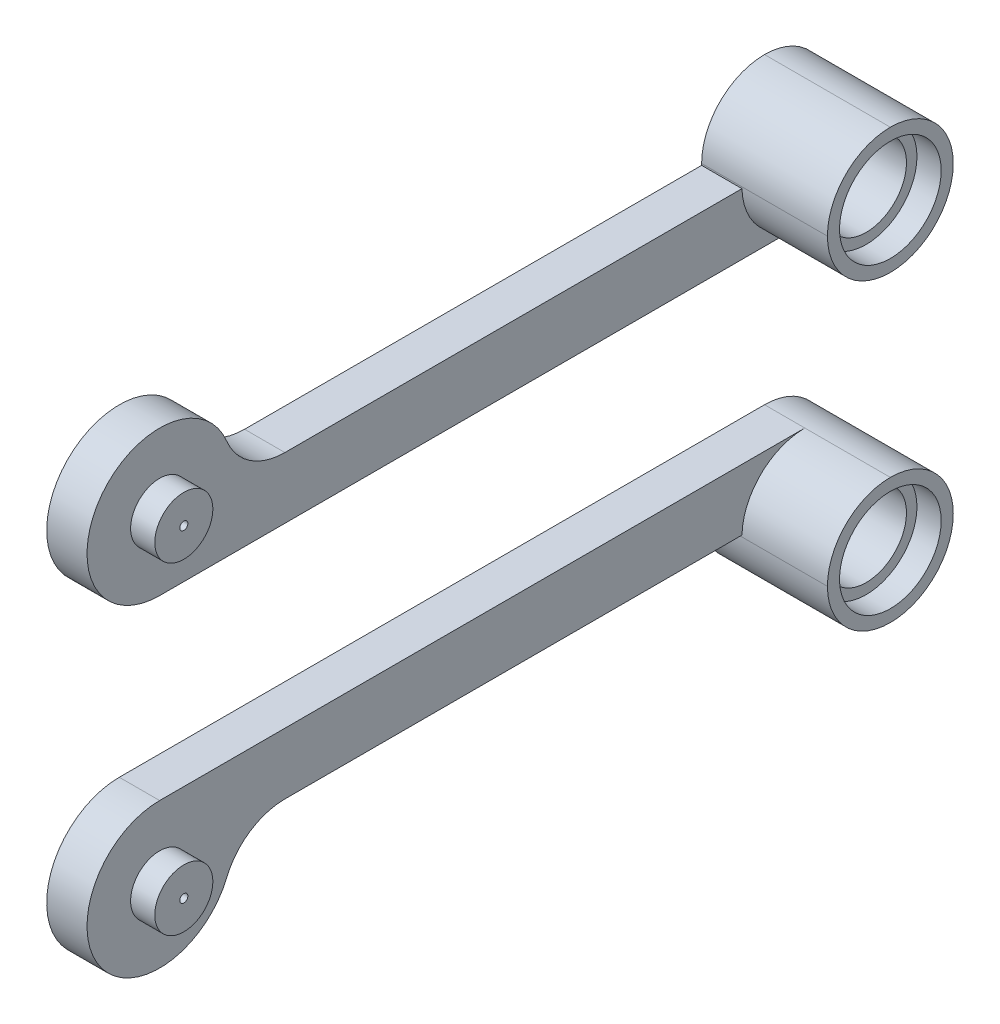
ISO-10303-21;
HEADER;
FILE_DESCRIPTION(('STEP AP214'),'2;1');
FILE_NAME('part.step','',(''),(''),'','','');
FILE_SCHEMA(('AUTOMOTIVE_DESIGN { 1 0 10303 214 1 1 1 1 }'));
ENDSEC;
DATA;
#1=APPLICATION_CONTEXT('core data for automotive mechanical design processes');
#2=APPLICATION_PROTOCOL_DEFINITION('international standard','automotive_design',2000,#1);
#3=PRODUCT_CONTEXT('',#1,'mechanical');
#4=PRODUCT('Part','Part','',(#3));
#5=PRODUCT_RELATED_PRODUCT_CATEGORY('part','',(#4));
#6=PRODUCT_DEFINITION_FORMATION('','',#4);
#7=PRODUCT_DEFINITION_CONTEXT('part definition',#1,'design');
#8=PRODUCT_DEFINITION('design','',#6,#7);
#9=PRODUCT_DEFINITION_SHAPE('','',#8);
#10=(LENGTH_UNIT() NAMED_UNIT(*) SI_UNIT(.MILLI.,.METRE.));
#11=(NAMED_UNIT(*) PLANE_ANGLE_UNIT() SI_UNIT($,.RADIAN.));
#12=(NAMED_UNIT(*) SI_UNIT($,.STERADIAN.) SOLID_ANGLE_UNIT());
#13=UNCERTAINTY_MEASURE_WITH_UNIT(LENGTH_MEASURE(1.E-05),#10,'distance_accuracy_value','');
#14=(GEOMETRIC_REPRESENTATION_CONTEXT(3) GLOBAL_UNCERTAINTY_ASSIGNED_CONTEXT((#13)) GLOBAL_UNIT_ASSIGNED_CONTEXT((#10,
#11,#12)) REPRESENTATION_CONTEXT('',''));
#15=CARTESIAN_POINT('',(0.,0.,0.));
#16=DIRECTION('',(0.,0.,1.));
#17=DIRECTION('',(1.,0.,0.));
#18=AXIS2_PLACEMENT_3D('',#15,#16,#17);
#19=CARTESIAN_POINT('',(7.8,-19.4,-40.));
#20=DIRECTION('',(-1.,0.,0.));
#21=DIRECTION('',(0.,0.,1.));
#22=AXIS2_PLACEMENT_3D('',#19,#20,#21);
#23=CYLINDRICAL_SURFACE('',#22,2.5);
#24=CARTESIAN_POINT('',(1.5,-19.4,-40.));
#25=DIRECTION('',(-1.,0.,0.));
#26=DIRECTION('',(0.,0.,-1.));
#27=AXIS2_PLACEMENT_3D('',#24,#25,#26);
#28=CIRCLE('',#27,2.5);
#29=CARTESIAN_POINT('',(1.5,-19.4,-42.5));
#30=VERTEX_POINT('',#29);
#31=EDGE_CURVE('E233',#30,#30,#28,.T.);
#32=ORIENTED_EDGE('',*,*,#31,.T.);
#33=EDGE_LOOP('',(#32));
#34=FACE_BOUND('',#33,.T.);
#35=CARTESIAN_POINT('',(6.3,-19.4,-40.));
#36=DIRECTION('',(-1.,0.,0.));
#37=DIRECTION('',(0.,0.,-1.));
#38=AXIS2_PLACEMENT_3D('',#35,#36,#37);
#39=CIRCLE('',#38,2.5);
#40=CARTESIAN_POINT('',(6.3,-19.4,-42.5));
#41=VERTEX_POINT('',#40);
#42=EDGE_CURVE('E221',#41,#41,#39,.T.);
#43=ORIENTED_EDGE('',*,*,#42,.F.);
#44=EDGE_LOOP('',(#43));
#45=FACE_BOUND('',#44,.T.);
#46=ADVANCED_FACE('F78',(#34,#45),#23,.F.);
#47=CARTESIAN_POINT('',(2.5,-20.,0.));
#48=DIRECTION('',(-1.,0.,0.));
#49=DIRECTION('',(0.,0.,1.));
#50=AXIS2_PLACEMENT_3D('',#47,#48,#49);
#51=CYLINDRICAL_SURFACE('',#50,4.5);
#52=CARTESIAN_POINT('',(2.5,-20.,0.));
#53=DIRECTION('',(-1.,0.,0.));
#54=DIRECTION('',(0.,0.,-1.));
#55=AXIS2_PLACEMENT_3D('',#52,#53,#54);
#56=CIRCLE('',#55,4.5);
#57=CARTESIAN_POINT('',(2.5,-21.7142857142857,-4.16067596548877));
#58=VERTEX_POINT('',#57);
#59=CARTESIAN_POINT('',(2.5,-15.5,0.));
#60=VERTEX_POINT('',#59);
#61=EDGE_CURVE('E171',#58,#60,#56,.T.);
#62=ORIENTED_EDGE('',*,*,#61,.T.);
#63=DIRECTION('',(-1.,0.,0.));
#64=VECTOR('',#63,1.);
#65=CARTESIAN_POINT('',(2.5,-15.5,0.));
#66=LINE('',#65,#64);
#67=CARTESIAN_POINT('',(0.,-15.5,0.));
#68=VERTEX_POINT('',#67);
#69=EDGE_CURVE('E152',#60,#68,#66,.T.);
#70=ORIENTED_EDGE('',*,*,#69,.T.);
#71=CARTESIAN_POINT('',(0.,-20.,0.));
#72=DIRECTION('',(-1.,0.,0.));
#73=DIRECTION('',(0.,0.,-1.));
#74=AXIS2_PLACEMENT_3D('',#71,#72,#73);
#75=CIRCLE('',#74,4.5);
#76=CARTESIAN_POINT('',(0.,-21.7142857142857,-4.16067596548877));
#77=VERTEX_POINT('',#76);
#78=EDGE_CURVE('E163',#77,#68,#75,.T.);
#79=ORIENTED_EDGE('',*,*,#78,.F.);
#80=DIRECTION('',(-1.,0.,0.));
#81=VECTOR('',#80,1.);
#82=CARTESIAN_POINT('',(2.5,-21.7142857142857,-4.16067596548877));
#83=LINE('',#82,#81);
#84=EDGE_CURVE('E178',#58,#77,#83,.T.);
#85=ORIENTED_EDGE('',*,*,#84,.F.);
#86=EDGE_LOOP('',(#62,#70,#79,#85));
#87=FACE_BOUND('',#86,.T.);
#88=ADVANCED_FACE('F173',(#87),#51,.T.);
#89=CARTESIAN_POINT('',(0.,-20.,0.));
#90=DIRECTION('',(1.,0.,0.));
#91=DIRECTION('',(0.,0.,-1.));
#92=AXIS2_PLACEMENT_3D('',#89,#90,#91);
#93=PLANE('',#92);
#94=CARTESIAN_POINT('',(0.,-19.4,-40.));
#95=DIRECTION('',(-1.,0.,0.));
#96=DIRECTION('',(0.,0.,-1.));
#97=AXIS2_PLACEMENT_3D('',#94,#95,#96);
#98=CIRCLE('',#97,3.15);
#99=CARTESIAN_POINT('',(0.,-19.4,-43.15));
#100=VERTEX_POINT('',#99);
#101=EDGE_CURVE('E230',#100,#100,#98,.T.);
#102=ORIENTED_EDGE('',*,*,#101,.F.);
#103=EDGE_LOOP('',(#102));
#104=FACE_BOUND('',#103,.T.);
#105=DIRECTION('',(0.,0.,1.));
#106=VECTOR('',#105,1.);
#107=CARTESIAN_POINT('',(0.,-19.3,0.));
#108=LINE('',#107,#106);
#109=CARTESIAN_POINT('',(0.,-19.3,-36.1012822620764));
#110=VERTEX_POINT('',#109);
#111=CARTESIAN_POINT('',(0.,-19.3,-7.76659513557904));
#112=VERTEX_POINT('',#111);
#113=EDGE_CURVE('E216',#110,#112,#108,.T.);
#114=ORIENTED_EDGE('',*,*,#113,.T.);
#115=CARTESIAN_POINT('',(0.,-23.2,-7.76659513557904));
#116=DIRECTION('',(-1.,0.,0.));
#117=DIRECTION('',(0.,0.,-1.));
#118=AXIS2_PLACEMENT_3D('',#115,#116,#117);
#119=CIRCLE('',#118,3.9);
#120=EDGE_CURVE('E167',#77,#112,#119,.T.);
#121=ORIENTED_EDGE('',*,*,#120,.F.);
#122=ORIENTED_EDGE('',*,*,#78,.T.);
#123=DIRECTION('',(0.,0.,-1.));
#124=VECTOR('',#123,1.);
#125=CARTESIAN_POINT('',(0.,-15.5,0.));
#126=LINE('',#125,#124);
#127=CARTESIAN_POINT('',(0.,-15.5,-40.));
#128=VERTEX_POINT('',#127);
#129=EDGE_CURVE('E147',#68,#128,#126,.T.);
#130=ORIENTED_EDGE('',*,*,#129,.T.);
#131=CARTESIAN_POINT('',(0.,-19.4,-40.));
#132=DIRECTION('',(-1.,0.,0.));
#133=DIRECTION('',(0.,0.,-1.));
#134=AXIS2_PLACEMENT_3D('',#131,#132,#133);
#135=CIRCLE('',#134,3.9);
#136=CARTESIAN_POINT('',(0.,-19.4,-43.9));
#137=VERTEX_POINT('',#136);
#138=EDGE_CURVE('E189',#137,#128,#135,.F.);
#139=ORIENTED_EDGE('',*,*,#138,.F.);
#140=CARTESIAN_POINT('',(0.,-19.4,-40.));
#141=DIRECTION('',(-1.,0.,0.));
#142=DIRECTION('',(0.,0.,-1.));
#143=AXIS2_PLACEMENT_3D('',#140,#141,#142);
#144=CIRCLE('',#143,3.9);
#145=CARTESIAN_POINT('',(0.,-23.3,-40.));
#146=VERTEX_POINT('',#145);
#147=EDGE_CURVE('E186',#146,#137,#144,.F.);
#148=ORIENTED_EDGE('',*,*,#147,.F.);
#149=CARTESIAN_POINT('',(0.,-19.4,-40.));
#150=DIRECTION('',(-1.,0.,0.));
#151=DIRECTION('',(0.,0.,-1.));
#152=AXIS2_PLACEMENT_3D('',#149,#150,#151);
#153=CIRCLE('',#152,3.9);
#154=CARTESIAN_POINT('',(0.,-19.4,-36.1));
#155=VERTEX_POINT('',#154);
#156=EDGE_CURVE('E191',#155,#146,#153,.F.);
#157=ORIENTED_EDGE('',*,*,#156,.F.);
#158=CARTESIAN_POINT('',(0.,-19.4,-40.));
#159=DIRECTION('',(-1.,0.,0.));
#160=DIRECTION('',(0.,0.,-1.));
#161=AXIS2_PLACEMENT_3D('',#158,#159,#160);
#162=CIRCLE('',#161,3.9);
#163=EDGE_CURVE('E193',#110,#155,#162,.F.);
#164=ORIENTED_EDGE('',*,*,#163,.F.);
#165=EDGE_LOOP('',(#114,#121,#122,#130,#139,#148,#157,#164));
#166=FACE_BOUND('',#165,.T.);
#167=ADVANCED_FACE('F165',(#104,#166),#93,.F.);
#168=CARTESIAN_POINT('',(2.5,-20.,0.));
#169=DIRECTION('',(1.,0.,0.));
#170=DIRECTION('',(0.,0.,-1.));
#171=AXIS2_PLACEMENT_3D('',#168,#169,#170);
#172=PLANE('',#171);
#173=DIRECTION('',(0.,0.,-1.));
#174=VECTOR('',#173,1.);
#175=CARTESIAN_POINT('',(2.5,-19.3,0.));
#176=LINE('',#175,#174);
#177=CARTESIAN_POINT('',(2.5,-19.3,-7.76659513557904));
#178=VERTEX_POINT('',#177);
#179=CARTESIAN_POINT('',(2.5,-19.3,-36.1012822620764));
#180=VERTEX_POINT('',#179);
#181=EDGE_CURVE('E217',#178,#180,#176,.T.);
#182=ORIENTED_EDGE('',*,*,#181,.T.);
#183=CARTESIAN_POINT('',(2.5,-19.4,-40.));
#184=DIRECTION('',(-1.,0.,0.));
#185=DIRECTION('',(0.,0.,-1.));
#186=AXIS2_PLACEMENT_3D('',#183,#184,#185);
#187=CIRCLE('',#186,3.9);
#188=CARTESIAN_POINT('',(2.5,-15.5,-40.));
#189=VERTEX_POINT('',#188);
#190=EDGE_CURVE('E87',#189,#180,#187,.F.);
#191=ORIENTED_EDGE('',*,*,#190,.F.);
#192=DIRECTION('',(0.,0.,-1.));
#193=VECTOR('',#192,1.);
#194=CARTESIAN_POINT('',(2.5,-15.5,0.));
#195=LINE('',#194,#193);
#196=EDGE_CURVE('E159',#60,#189,#195,.T.);
#197=ORIENTED_EDGE('',*,*,#196,.F.);
#198=ORIENTED_EDGE('',*,*,#61,.F.);
#199=CARTESIAN_POINT('',(2.5,-23.2,-7.76659513557904));
#200=DIRECTION('',(-1.,0.,0.));
#201=DIRECTION('',(0.,0.,-1.));
#202=AXIS2_PLACEMENT_3D('',#199,#200,#201);
#203=CIRCLE('',#202,3.9);
#204=EDGE_CURVE('E208',#178,#58,#203,.F.);
#205=ORIENTED_EDGE('',*,*,#204,.F.);
#206=EDGE_LOOP('',(#182,#191,#197,#198,#205));
#207=FACE_BOUND('',#206,.T.);
#208=CARTESIAN_POINT('',(2.5,-20.,0.));
#209=DIRECTION('',(-1.,0.,0.));
#210=DIRECTION('',(0.,0.,-1.));
#211=AXIS2_PLACEMENT_3D('',#208,#209,#210);
#212=CIRCLE('',#211,1.8);
#213=CARTESIAN_POINT('',(2.5,-20.,-1.8));
#214=VERTEX_POINT('',#213);
#215=EDGE_CURVE('E244',#214,#214,#212,.T.);
#216=ORIENTED_EDGE('',*,*,#215,.T.);
#217=EDGE_LOOP('',(#216));
#218=FACE_BOUND('',#217,.T.);
#219=ADVANCED_FACE('F250',(#207,#218),#172,.T.);
#220=CARTESIAN_POINT('',(2.5,-15.5,0.));
#221=DIRECTION('',(0.,-1.,0.));
#222=DIRECTION('',(0.,0.,1.));
#223=AXIS2_PLACEMENT_3D('',#220,#221,#222);
#224=PLANE('',#223);
#225=DIRECTION('',(-1.,0.,0.));
#226=VECTOR('',#225,1.);
#227=CARTESIAN_POINT('',(2.5,-15.5,-40.));
#228=LINE('',#227,#226);
#229=EDGE_CURVE('E155',#128,#189,#228,.F.);
#230=ORIENTED_EDGE('',*,*,#229,.F.);
#231=ORIENTED_EDGE('',*,*,#129,.F.);
#232=ORIENTED_EDGE('',*,*,#69,.F.);
#233=ORIENTED_EDGE('',*,*,#196,.T.);
#234=EDGE_LOOP('',(#230,#231,#232,#233));
#235=FACE_BOUND('',#234,.T.);
#236=ADVANCED_FACE('F149',(#235),#224,.F.);
#237=CARTESIAN_POINT('',(4.,-20.,0.));
#238=DIRECTION('',(1.,0.,0.));
#239=DIRECTION('',(0.,0.,-1.));
#240=AXIS2_PLACEMENT_3D('',#237,#238,#239);
#241=PLANE('',#240);
#242=CARTESIAN_POINT('',(4.,-20.,0.));
#243=DIRECTION('',(-1.,0.,0.));
#244=DIRECTION('',(0.,0.,-1.));
#245=AXIS2_PLACEMENT_3D('',#242,#243,#244);
#246=CIRCLE('',#245,1.8);
#247=CARTESIAN_POINT('',(4.,-20.,-1.8));
#248=VERTEX_POINT('',#247);
#249=EDGE_CURVE('E160',#248,#248,#246,.T.);
#250=ORIENTED_EDGE('',*,*,#249,.F.);
#251=EDGE_LOOP('',(#250));
#252=FACE_BOUND('',#251,.T.);
#253=CARTESIAN_POINT('',(4.,-20.,0.));
#254=DIRECTION('',(-1.,0.,0.));
#255=DIRECTION('',(0.,0.,-1.));
#256=AXIS2_PLACEMENT_3D('',#253,#254,#255);
#257=CIRCLE('',#256,0.25);
#258=CARTESIAN_POINT('',(4.,-20.,-0.25));
#259=VERTEX_POINT('',#258);
#260=EDGE_CURVE('E239',#259,#259,#257,.T.);
#261=ORIENTED_EDGE('',*,*,#260,.T.);
#262=EDGE_LOOP('',(#261));
#263=FACE_BOUND('',#262,.T.);
#264=ADVANCED_FACE('F255',(#252,#263),#241,.T.);
#265=CARTESIAN_POINT('',(4.,-20.,0.));
#266=DIRECTION('',(-1.,0.,0.));
#267=DIRECTION('',(0.,0.,1.));
#268=AXIS2_PLACEMENT_3D('',#265,#266,#267);
#269=CYLINDRICAL_SURFACE('',#268,1.8);
#270=ORIENTED_EDGE('',*,*,#249,.T.);
#271=EDGE_LOOP('',(#270));
#272=FACE_BOUND('',#271,.T.);
#273=ORIENTED_EDGE('',*,*,#215,.F.);
#274=EDGE_LOOP('',(#273));
#275=FACE_BOUND('',#274,.T.);
#276=ADVANCED_FACE('F252',(#272,#275),#269,.T.);
#277=CARTESIAN_POINT('',(4.,-20.,0.));
#278=DIRECTION('',(-1.,0.,0.));
#279=DIRECTION('',(0.,0.,1.));
#280=AXIS2_PLACEMENT_3D('',#277,#278,#279);
#281=CYLINDRICAL_SURFACE('',#280,0.25);
#282=ORIENTED_EDGE('',*,*,#260,.F.);
#283=EDGE_LOOP('',(#282));
#284=FACE_BOUND('',#283,.T.);
#285=CARTESIAN_POINT('',(2.5,-20.,0.));
#286=DIRECTION('',(-1.,0.,0.));
#287=DIRECTION('',(0.,0.,-1.));
#288=AXIS2_PLACEMENT_3D('',#285,#286,#287);
#289=CIRCLE('',#288,0.25);
#290=CARTESIAN_POINT('',(2.5,-20.,-0.25));
#291=VERTEX_POINT('',#290);
#292=EDGE_CURVE('E175',#291,#291,#289,.F.);
#293=ORIENTED_EDGE('',*,*,#292,.F.);
#294=EDGE_LOOP('',(#293));
#295=FACE_BOUND('',#294,.T.);
#296=ADVANCED_FACE('F254',(#284,#295),#281,.F.);
#297=ORIENTED_EDGE('',*,*,#292,.T.);
#298=EDGE_LOOP('',(#297));
#299=FACE_BOUND('',#298,.T.);
#300=ADVANCED_FACE('F262',(#299),#172,.T.);
#301=CARTESIAN_POINT('',(7.8,-20.,0.));
#302=DIRECTION('',(1.,0.,0.));
#303=DIRECTION('',(0.,0.,-1.));
#304=AXIS2_PLACEMENT_3D('',#301,#302,#303);
#305=PLANE('',#304);
#306=CARTESIAN_POINT('',(7.8,-19.4,-40.));
#307=DIRECTION('',(-1.,0.,0.));
#308=DIRECTION('',(0.,0.,-1.));
#309=AXIS2_PLACEMENT_3D('',#306,#307,#308);
#310=CIRCLE('',#309,3.15);
#311=CARTESIAN_POINT('',(7.8,-19.4,-43.15));
#312=VERTEX_POINT('',#311);
#313=EDGE_CURVE('E226',#312,#312,#310,.T.);
#314=ORIENTED_EDGE('',*,*,#313,.T.);
#315=EDGE_LOOP('',(#314));
#316=FACE_BOUND('',#315,.T.);
#317=CARTESIAN_POINT('',(7.8,-19.4,-40.));
#318=DIRECTION('',(-1.,0.,0.));
#319=DIRECTION('',(0.,0.,-1.));
#320=AXIS2_PLACEMENT_3D('',#317,#318,#319);
#321=CIRCLE('',#320,3.9);
#322=CARTESIAN_POINT('',(7.8,-23.3,-40.));
#323=VERTEX_POINT('',#322);
#324=CARTESIAN_POINT('',(7.8,-19.4,-36.1));
#325=VERTEX_POINT('',#324);
#326=EDGE_CURVE('E202',#323,#325,#321,.T.);
#327=ORIENTED_EDGE('',*,*,#326,.F.);
#328=CARTESIAN_POINT('',(7.8,-19.4,-40.));
#329=DIRECTION('',(-1.,0.,0.));
#330=DIRECTION('',(0.,0.,-1.));
#331=AXIS2_PLACEMENT_3D('',#328,#329,#330);
#332=CIRCLE('',#331,3.9);
#333=CARTESIAN_POINT('',(7.8,-19.4,-43.9));
#334=VERTEX_POINT('',#333);
#335=EDGE_CURVE('E197',#334,#323,#332,.T.);
#336=ORIENTED_EDGE('',*,*,#335,.F.);
#337=CARTESIAN_POINT('',(7.8,-19.4,-40.));
#338=DIRECTION('',(-1.,0.,0.));
#339=DIRECTION('',(0.,0.,-1.));
#340=AXIS2_PLACEMENT_3D('',#337,#338,#339);
#341=CIRCLE('',#340,3.9);
#342=CARTESIAN_POINT('',(7.8,-15.5,-40.));
#343=VERTEX_POINT('',#342);
#344=EDGE_CURVE('E199',#343,#334,#341,.T.);
#345=ORIENTED_EDGE('',*,*,#344,.F.);
#346=CARTESIAN_POINT('',(7.8,-19.4,-40.));
#347=DIRECTION('',(-1.,0.,0.));
#348=DIRECTION('',(0.,0.,-1.));
#349=AXIS2_PLACEMENT_3D('',#346,#347,#348);
#350=CIRCLE('',#349,3.9);
#351=EDGE_CURVE('E204',#325,#343,#350,.T.);
#352=ORIENTED_EDGE('',*,*,#351,.F.);
#353=EDGE_LOOP('',(#327,#336,#345,#352));
#354=FACE_BOUND('',#353,.T.);
#355=ADVANCED_FACE('F280',(#316,#354),#305,.T.);
#356=CARTESIAN_POINT('',(1.5,-19.4,-40.));
#357=DIRECTION('',(-1.,0.,0.));
#358=DIRECTION('',(0.,0.,1.));
#359=AXIS2_PLACEMENT_3D('',#356,#357,#358);
#360=CYLINDRICAL_SURFACE('',#359,3.15);
#361=CARTESIAN_POINT('',(1.5,-19.4,-40.));
#362=DIRECTION('',(-1.,0.,0.));
#363=DIRECTION('',(0.,0.,-1.));
#364=AXIS2_PLACEMENT_3D('',#361,#362,#363);
#365=CIRCLE('',#364,3.15);
#366=CARTESIAN_POINT('',(1.5,-19.4,-43.15));
#367=VERTEX_POINT('',#366);
#368=EDGE_CURVE('E236',#367,#367,#365,.T.);
#369=ORIENTED_EDGE('',*,*,#368,.F.);
#370=EDGE_LOOP('',(#369));
#371=FACE_BOUND('',#370,.T.);
#372=ORIENTED_EDGE('',*,*,#101,.T.);
#373=EDGE_LOOP('',(#372));
#374=FACE_BOUND('',#373,.T.);
#375=ADVANCED_FACE('F278',(#371,#374),#360,.F.);
#376=CARTESIAN_POINT('',(1.5,-20.,0.));
#377=DIRECTION('',(1.,0.,0.));
#378=DIRECTION('',(0.,0.,-1.));
#379=AXIS2_PLACEMENT_3D('',#376,#377,#378);
#380=PLANE('',#379);
#381=ORIENTED_EDGE('',*,*,#31,.F.);
#382=EDGE_LOOP('',(#381));
#383=FACE_BOUND('',#382,.T.);
#384=ORIENTED_EDGE('',*,*,#368,.T.);
#385=EDGE_LOOP('',(#384));
#386=FACE_BOUND('',#385,.T.);
#387=ADVANCED_FACE('F287',(#383,#386),#380,.F.);
#388=CARTESIAN_POINT('',(6.3,-19.4,-40.));
#389=DIRECTION('',(1.,0.,0.));
#390=DIRECTION('',(0.,0.,-1.));
#391=AXIS2_PLACEMENT_3D('',#388,#389,#390);
#392=CYLINDRICAL_SURFACE('',#391,3.15);
#393=CARTESIAN_POINT('',(6.3,-19.4,-40.));
#394=DIRECTION('',(-1.,0.,0.));
#395=DIRECTION('',(0.,0.,-1.));
#396=AXIS2_PLACEMENT_3D('',#393,#394,#395);
#397=CIRCLE('',#396,3.15);
#398=CARTESIAN_POINT('',(6.3,-19.4,-43.15));
#399=VERTEX_POINT('',#398);
#400=EDGE_CURVE('E227',#399,#399,#397,.T.);
#401=ORIENTED_EDGE('',*,*,#400,.T.);
#402=EDGE_LOOP('',(#401));
#403=FACE_BOUND('',#402,.T.);
#404=ORIENTED_EDGE('',*,*,#313,.F.);
#405=EDGE_LOOP('',(#404));
#406=FACE_BOUND('',#405,.T.);
#407=ADVANCED_FACE('F407',(#403,#406),#392,.F.);
#408=CARTESIAN_POINT('',(6.3,-19.4,-40.));
#409=DIRECTION('',(1.,0.,0.));
#410=DIRECTION('',(0.,0.,-1.));
#411=AXIS2_PLACEMENT_3D('',#408,#409,#410);
#412=PLANE('',#411);
#413=ORIENTED_EDGE('',*,*,#42,.T.);
#414=EDGE_LOOP('',(#413));
#415=FACE_BOUND('',#414,.T.);
#416=ORIENTED_EDGE('',*,*,#400,.F.);
#417=EDGE_LOOP('',(#416));
#418=FACE_BOUND('',#417,.T.);
#419=ADVANCED_FACE('F314',(#415,#418),#412,.T.);
#420=CARTESIAN_POINT('',(7.8,-19.3,0.));
#421=DIRECTION('',(0.,1.,0.));
#422=DIRECTION('',(0.,0.,-1.));
#423=AXIS2_PLACEMENT_3D('',#420,#421,#422);
#424=PLANE('',#423);
#425=ORIENTED_EDGE('',*,*,#113,.F.);
#426=DIRECTION('',(1.,0.,0.));
#427=VECTOR('',#426,1.);
#428=CARTESIAN_POINT('',(2.5,-19.3,-36.1012822620764));
#429=LINE('',#428,#427);
#430=EDGE_CURVE('E13',#180,#110,#429,.F.);
#431=ORIENTED_EDGE('',*,*,#430,.F.);
#432=ORIENTED_EDGE('',*,*,#181,.F.);
#433=DIRECTION('',(1.,0.,0.));
#434=VECTOR('',#433,1.);
#435=CARTESIAN_POINT('',(2.5,-19.3,-7.76659513557904));
#436=LINE('',#435,#434);
#437=EDGE_CURVE('E184',#112,#178,#436,.T.);
#438=ORIENTED_EDGE('',*,*,#437,.F.);
#439=EDGE_LOOP('',(#425,#431,#432,#438));
#440=FACE_BOUND('',#439,.T.);
#441=ADVANCED_FACE('F308',(#440),#424,.F.);
#442=CARTESIAN_POINT('',(2.5,-23.2,-7.76659513557904));
#443=DIRECTION('',(-1.,0.,0.));
#444=DIRECTION('',(0.,0.,1.));
#445=AXIS2_PLACEMENT_3D('',#442,#443,#444);
#446=CYLINDRICAL_SURFACE('',#445,3.9);
#447=ORIENTED_EDGE('',*,*,#204,.T.);
#448=ORIENTED_EDGE('',*,*,#84,.T.);
#449=ORIENTED_EDGE('',*,*,#120,.T.);
#450=ORIENTED_EDGE('',*,*,#437,.T.);
#451=EDGE_LOOP('',(#447,#448,#449,#450));
#452=FACE_BOUND('',#451,.T.);
#453=ADVANCED_FACE('F302',(#452),#446,.F.);
#454=CARTESIAN_POINT('',(2.5,-19.4,-40.));
#455=DIRECTION('',(1.,0.,0.));
#456=DIRECTION('',(0.,0.,-1.));
#457=AXIS2_PLACEMENT_3D('',#454,#455,#456);
#458=CYLINDRICAL_SURFACE('',#457,3.9);
#459=DIRECTION('',(-1.,0.,0.));
#460=VECTOR('',#459,1.);
#461=CARTESIAN_POINT('',(7.8,-19.4,-43.9));
#462=LINE('',#461,#460);
#463=EDGE_CURVE('E214',#137,#334,#462,.F.);
#464=ORIENTED_EDGE('',*,*,#463,.T.);
#465=ORIENTED_EDGE('',*,*,#335,.T.);
#466=DIRECTION('',(-1.,0.,0.));
#467=VECTOR('',#466,1.);
#468=CARTESIAN_POINT('',(0.,-23.3,-40.));
#469=LINE('',#468,#467);
#470=EDGE_CURVE('E82',#323,#146,#469,.T.);
#471=ORIENTED_EDGE('',*,*,#470,.T.);
#472=ORIENTED_EDGE('',*,*,#147,.T.);
#473=EDGE_LOOP('',(#464,#465,#471,#472));
#474=FACE_BOUND('',#473,.T.);
#475=ADVANCED_FACE('F80',(#474),#458,.T.);
#476=CARTESIAN_POINT('',(7.8,-19.4,-40.));
#477=DIRECTION('',(-1.,0.,0.));
#478=DIRECTION('',(0.,0.,1.));
#479=AXIS2_PLACEMENT_3D('',#476,#477,#478);
#480=CYLINDRICAL_SURFACE('',#479,3.9);
#481=ORIENTED_EDGE('',*,*,#470,.F.);
#482=ORIENTED_EDGE('',*,*,#326,.T.);
#483=DIRECTION('',(-1.,0.,0.));
#484=VECTOR('',#483,1.);
#485=CARTESIAN_POINT('',(7.8,-19.4,-36.1));
#486=LINE('',#485,#484);
#487=EDGE_CURVE('E213',#325,#155,#486,.T.);
#488=ORIENTED_EDGE('',*,*,#487,.T.);
#489=ORIENTED_EDGE('',*,*,#156,.T.);
#490=EDGE_LOOP('',(#481,#482,#488,#489));
#491=FACE_BOUND('',#490,.T.);
#492=ADVANCED_FACE('F296',(#491),#480,.T.);
#493=CARTESIAN_POINT('',(2.5,-19.4,-40.));
#494=DIRECTION('',(-1.,0.,0.));
#495=DIRECTION('',(0.,0.,1.));
#496=AXIS2_PLACEMENT_3D('',#493,#494,#495);
#497=CYLINDRICAL_SURFACE('',#496,3.9);
#498=ORIENTED_EDGE('',*,*,#463,.F.);
#499=ORIENTED_EDGE('',*,*,#138,.T.);
#500=ORIENTED_EDGE('',*,*,#229,.T.);
#501=DIRECTION('',(-1.,0.,0.));
#502=VECTOR('',#501,1.);
#503=CARTESIAN_POINT('',(2.5,-15.5,-40.));
#504=LINE('',#503,#502);
#505=EDGE_CURVE('E211',#189,#343,#504,.F.);
#506=ORIENTED_EDGE('',*,*,#505,.T.);
#507=ORIENTED_EDGE('',*,*,#344,.T.);
#508=EDGE_LOOP('',(#498,#499,#500,#506,#507));
#509=FACE_BOUND('',#508,.T.);
#510=ADVANCED_FACE('F307',(#509),#497,.T.);
#511=CARTESIAN_POINT('',(2.5,-19.4,-40.));
#512=DIRECTION('',(1.,0.,0.));
#513=DIRECTION('',(0.,0.,-1.));
#514=AXIS2_PLACEMENT_3D('',#511,#512,#513);
#515=CYLINDRICAL_SURFACE('',#514,3.9);
#516=ORIENTED_EDGE('',*,*,#351,.T.);
#517=ORIENTED_EDGE('',*,*,#505,.F.);
#518=ORIENTED_EDGE('',*,*,#190,.T.);
#519=ORIENTED_EDGE('',*,*,#430,.T.);
#520=ORIENTED_EDGE('',*,*,#163,.T.);
#521=ORIENTED_EDGE('',*,*,#487,.F.);
#522=EDGE_LOOP('',(#516,#517,#518,#519,#520,#521));
#523=FACE_BOUND('',#522,.T.);
#524=ADVANCED_FACE('F300',(#523),#515,.T.);
#525=CLOSED_SHELL('',(#46,#88,#167,#219,#236,#264,#276,#296,#300,#355,#375,#387,#407,#419,#441,
#453,#475,#492,#510,#524));
#526=MANIFOLD_SOLID_BREP('B2',#525);
#527=CARTESIAN_POINT('',(7.8,-0.599999999999998,-40.));
#528=DIRECTION('',(-1.,0.,0.));
#529=DIRECTION('',(0.,0.,1.));
#530=AXIS2_PLACEMENT_3D('',#527,#528,#529);
#531=CYLINDRICAL_SURFACE('',#530,2.5);
#532=CARTESIAN_POINT('',(1.5,-0.599999999999998,-40.));
#533=DIRECTION('',(1.,0.,0.));
#534=DIRECTION('',(0.,0.,-1.));
#535=AXIS2_PLACEMENT_3D('',#532,#533,#534);
#536=CIRCLE('',#535,2.5);
#537=CARTESIAN_POINT('',(1.5,-0.599999999999998,-42.5));
#538=VERTEX_POINT('',#537);
#539=EDGE_CURVE('E637',#538,#538,#536,.T.);
#540=ORIENTED_EDGE('',*,*,#539,.F.);
#541=EDGE_LOOP('',(#540));
#542=FACE_BOUND('',#541,.T.);
#543=CARTESIAN_POINT('',(6.3,-0.599999999999998,-40.));
#544=DIRECTION('',(1.,0.,0.));
#545=DIRECTION('',(0.,0.,-1.));
#546=AXIS2_PLACEMENT_3D('',#543,#544,#545);
#547=CIRCLE('',#546,2.5);
#548=CARTESIAN_POINT('',(6.3,-0.599999999999998,-42.5));
#549=VERTEX_POINT('',#548);
#550=EDGE_CURVE('E625',#549,#549,#547,.T.);
#551=ORIENTED_EDGE('',*,*,#550,.T.);
#552=EDGE_LOOP('',(#551));
#553=FACE_BOUND('',#552,.T.);
#554=ADVANCED_FACE('F478',(#542,#553),#531,.F.);
#555=CARTESIAN_POINT('',(2.5,0.,0.));
#556=DIRECTION('',(-1.,0.,0.));
#557=DIRECTION('',(0.,0.,1.));
#558=AXIS2_PLACEMENT_3D('',#555,#556,#557);
#559=CYLINDRICAL_SURFACE('',#558,4.5);
#560=CARTESIAN_POINT('',(2.5,0.,0.));
#561=DIRECTION('',(1.,0.,0.));
#562=DIRECTION('',(0.,0.,-1.));
#563=AXIS2_PLACEMENT_3D('',#560,#561,#562);
#564=CIRCLE('',#563,4.5);
#565=CARTESIAN_POINT('',(2.5,1.71428571428571,-4.16067596548877));
#566=VERTEX_POINT('',#565);
#567=CARTESIAN_POINT('',(2.5,-4.5,0.));
#568=VERTEX_POINT('',#567);
#569=EDGE_CURVE('E559',#566,#568,#564,.T.);
#570=ORIENTED_EDGE('',*,*,#569,.F.);
#571=DIRECTION('',(-1.,0.,0.));
#572=VECTOR('',#571,1.);
#573=CARTESIAN_POINT('',(2.5,1.71428571428571,-4.16067596548877));
#574=LINE('',#573,#572);
#575=CARTESIAN_POINT('',(0.,1.71428571428571,-4.16067596548877));
#576=VERTEX_POINT('',#575);
#577=EDGE_CURVE('E556',#566,#576,#574,.T.);
#578=ORIENTED_EDGE('',*,*,#577,.T.);
#579=CARTESIAN_POINT('',(0.,0.,0.));
#580=DIRECTION('',(1.,0.,0.));
#581=DIRECTION('',(0.,0.,-1.));
#582=AXIS2_PLACEMENT_3D('',#579,#580,#581);
#583=CIRCLE('',#582,4.5);
#584=CARTESIAN_POINT('',(0.,-4.5,0.));
#585=VERTEX_POINT('',#584);
#586=EDGE_CURVE('E549',#576,#585,#583,.T.);
#587=ORIENTED_EDGE('',*,*,#586,.T.);
#588=DIRECTION('',(-1.,0.,0.));
#589=VECTOR('',#588,1.);
#590=CARTESIAN_POINT('',(2.5,-4.5,0.));
#591=LINE('',#590,#589);
#592=EDGE_CURVE('E553',#568,#585,#591,.T.);
#593=ORIENTED_EDGE('',*,*,#592,.F.);
#594=EDGE_LOOP('',(#570,#578,#587,#593));
#595=FACE_BOUND('',#594,.T.);
#596=ADVANCED_FACE('F552',(#595),#559,.T.);
#597=CARTESIAN_POINT('',(0.,0.,0.));
#598=DIRECTION('',(1.,0.,0.));
#599=DIRECTION('',(0.,0.,-1.));
#600=AXIS2_PLACEMENT_3D('',#597,#598,#599);
#601=PLANE('',#600);
#602=CARTESIAN_POINT('',(0.,-0.599999999999998,-40.));
#603=DIRECTION('',(1.,0.,0.));
#604=DIRECTION('',(0.,0.,-1.));
#605=AXIS2_PLACEMENT_3D('',#602,#603,#604);
#606=CIRCLE('',#605,3.15);
#607=CARTESIAN_POINT('',(0.,-0.599999999999998,-43.15));
#608=VERTEX_POINT('',#607);
#609=EDGE_CURVE('E634',#608,#608,#606,.T.);
#610=ORIENTED_EDGE('',*,*,#609,.T.);
#611=EDGE_LOOP('',(#610));
#612=FACE_BOUND('',#611,.T.);
#613=DIRECTION('',(0.,0.,1.));
#614=VECTOR('',#613,1.);
#615=CARTESIAN_POINT('',(0.,-0.7,0.));
#616=LINE('',#615,#614);
#617=CARTESIAN_POINT('',(0.,-0.7,-36.1012822620764));
#618=VERTEX_POINT('',#617);
#619=CARTESIAN_POINT('',(0.,-0.7,-7.76659513557904));
#620=VERTEX_POINT('',#619);
#621=EDGE_CURVE('E618',#618,#620,#616,.T.);
#622=ORIENTED_EDGE('',*,*,#621,.F.);
#623=CARTESIAN_POINT('',(0.,-0.6,-40.));
#624=DIRECTION('',(1.,0.,0.));
#625=DIRECTION('',(0.,0.,-1.));
#626=AXIS2_PLACEMENT_3D('',#623,#624,#625);
#627=CIRCLE('',#626,3.9);
#628=CARTESIAN_POINT('',(0.,-0.6,-36.1));
#629=VERTEX_POINT('',#628);
#630=EDGE_CURVE('E590',#618,#629,#627,.F.);
#631=ORIENTED_EDGE('',*,*,#630,.T.);
#632=CARTESIAN_POINT('',(0.,-0.6,-40.));
#633=DIRECTION('',(1.,0.,0.));
#634=DIRECTION('',(0.,0.,-1.));
#635=AXIS2_PLACEMENT_3D('',#632,#633,#634);
#636=CIRCLE('',#635,3.9);
#637=CARTESIAN_POINT('',(0.,3.3,-40.));
#638=VERTEX_POINT('',#637);
#639=EDGE_CURVE('E588',#629,#638,#636,.F.);
#640=ORIENTED_EDGE('',*,*,#639,.T.);
#641=CARTESIAN_POINT('',(0.,-0.6,-40.));
#642=DIRECTION('',(1.,0.,0.));
#643=DIRECTION('',(0.,0.,-1.));
#644=AXIS2_PLACEMENT_3D('',#641,#642,#643);
#645=CIRCLE('',#644,3.9);
#646=CARTESIAN_POINT('',(0.,-0.599999999999993,-43.9));
#647=VERTEX_POINT('',#646);
#648=EDGE_CURVE('E585',#638,#647,#645,.F.);
#649=ORIENTED_EDGE('',*,*,#648,.T.);
#650=CARTESIAN_POINT('',(0.,-0.6,-40.));
#651=DIRECTION('',(1.,0.,0.));
#652=DIRECTION('',(0.,0.,-1.));
#653=AXIS2_PLACEMENT_3D('',#650,#651,#652);
#654=CIRCLE('',#653,3.9);
#655=CARTESIAN_POINT('',(0.,-4.5,-40.));
#656=VERTEX_POINT('',#655);
#657=EDGE_CURVE('E572',#647,#656,#654,.F.);
#658=ORIENTED_EDGE('',*,*,#657,.T.);
#659=DIRECTION('',(0.,0.,-1.));
#660=VECTOR('',#659,1.);
#661=CARTESIAN_POINT('',(0.,-4.5,0.));
#662=LINE('',#661,#660);
#663=EDGE_CURVE('E566',#585,#656,#662,.T.);
#664=ORIENTED_EDGE('',*,*,#663,.F.);
#665=ORIENTED_EDGE('',*,*,#586,.F.);
#666=CARTESIAN_POINT('',(0.,3.2,-7.76659513557904));
#667=DIRECTION('',(1.,0.,0.));
#668=DIRECTION('',(0.,0.,-1.));
#669=AXIS2_PLACEMENT_3D('',#666,#667,#668);
#670=CIRCLE('',#669,3.9);
#671=EDGE_CURVE('E602',#576,#620,#670,.T.);
#672=ORIENTED_EDGE('',*,*,#671,.T.);
#673=EDGE_LOOP('',(#622,#631,#640,#649,#658,#664,#665,#672));
#674=FACE_BOUND('',#673,.T.);
#675=ADVANCED_FACE('F570',(#612,#674),#601,.F.);
#676=CARTESIAN_POINT('',(2.5,0.,0.));
#677=DIRECTION('',(1.,0.,0.));
#678=DIRECTION('',(0.,0.,-1.));
#679=AXIS2_PLACEMENT_3D('',#676,#677,#678);
#680=PLANE('',#679);
#681=DIRECTION('',(0.,0.,-1.));
#682=VECTOR('',#681,1.);
#683=CARTESIAN_POINT('',(2.5,-0.7,0.));
#684=LINE('',#683,#682);
#685=CARTESIAN_POINT('',(2.5,-0.7,-7.76659513557904));
#686=VERTEX_POINT('',#685);
#687=CARTESIAN_POINT('',(2.5,-0.7,-36.1012822620764));
#688=VERTEX_POINT('',#687);
#689=EDGE_CURVE('E494',#686,#688,#684,.T.);
#690=ORIENTED_EDGE('',*,*,#689,.F.);
#691=CARTESIAN_POINT('',(2.5,3.2,-7.76659513557904));
#692=DIRECTION('',(1.,0.,0.));
#693=DIRECTION('',(0.,0.,-1.));
#694=AXIS2_PLACEMENT_3D('',#691,#692,#693);
#695=CIRCLE('',#694,3.9);
#696=EDGE_CURVE('E604',#686,#566,#695,.F.);
#697=ORIENTED_EDGE('',*,*,#696,.T.);
#698=ORIENTED_EDGE('',*,*,#569,.T.);
#699=DIRECTION('',(0.,0.,-1.));
#700=VECTOR('',#699,1.);
#701=CARTESIAN_POINT('',(2.5,-4.5,0.));
#702=LINE('',#701,#700);
#703=CARTESIAN_POINT('',(2.5,-4.5,-40.));
#704=VERTEX_POINT('',#703);
#705=EDGE_CURVE('E560',#568,#704,#702,.T.);
#706=ORIENTED_EDGE('',*,*,#705,.T.);
#707=CARTESIAN_POINT('',(2.5,-0.6,-40.));
#708=DIRECTION('',(1.,0.,0.));
#709=DIRECTION('',(0.,0.,-1.));
#710=AXIS2_PLACEMENT_3D('',#707,#708,#709);
#711=CIRCLE('',#710,3.9);
#712=EDGE_CURVE('E487',#704,#688,#711,.F.);
#713=ORIENTED_EDGE('',*,*,#712,.T.);
#714=EDGE_LOOP('',(#690,#697,#698,#706,#713));
#715=FACE_BOUND('',#714,.T.);
#716=CARTESIAN_POINT('',(2.5,0.,0.));
#717=DIRECTION('',(1.,0.,0.));
#718=DIRECTION('',(0.,0.,-1.));
#719=AXIS2_PLACEMENT_3D('',#716,#717,#718);
#720=CIRCLE('',#719,1.8);
#721=CARTESIAN_POINT('',(2.5,0.,-1.8));
#722=VERTEX_POINT('',#721);
#723=EDGE_CURVE('E577',#722,#722,#720,.T.);
#724=ORIENTED_EDGE('',*,*,#723,.F.);
#725=EDGE_LOOP('',(#724));
#726=FACE_BOUND('',#725,.T.);
#727=ADVANCED_FACE('F651',(#715,#726),#680,.T.);
#728=CARTESIAN_POINT('',(2.5,-4.5,0.));
#729=DIRECTION('',(0.,1.,0.));
#730=DIRECTION('',(0.,0.,1.));
#731=AXIS2_PLACEMENT_3D('',#728,#729,#730);
#732=PLANE('',#731);
#733=DIRECTION('',(-1.,0.,0.));
#734=VECTOR('',#733,1.);
#735=CARTESIAN_POINT('',(2.5,-4.5,-40.));
#736=LINE('',#735,#734);
#737=EDGE_CURVE('E592',#656,#704,#736,.F.);
#738=ORIENTED_EDGE('',*,*,#737,.T.);
#739=ORIENTED_EDGE('',*,*,#705,.F.);
#740=ORIENTED_EDGE('',*,*,#592,.T.);
#741=ORIENTED_EDGE('',*,*,#663,.T.);
#742=EDGE_LOOP('',(#738,#739,#740,#741));
#743=FACE_BOUND('',#742,.T.);
#744=ADVANCED_FACE('F565',(#743),#732,.F.);
#745=CARTESIAN_POINT('',(4.,0.,0.));
#746=DIRECTION('',(1.,0.,0.));
#747=DIRECTION('',(0.,0.,-1.));
#748=AXIS2_PLACEMENT_3D('',#745,#746,#747);
#749=PLANE('',#748);
#750=CARTESIAN_POINT('',(4.,0.,0.));
#751=DIRECTION('',(1.,0.,0.));
#752=DIRECTION('',(0.,0.,-1.));
#753=AXIS2_PLACEMENT_3D('',#750,#751,#752);
#754=CIRCLE('',#753,1.8);
#755=CARTESIAN_POINT('',(4.,0.,-1.8));
#756=VERTEX_POINT('',#755);
#757=EDGE_CURVE('E573',#756,#756,#754,.T.);
#758=ORIENTED_EDGE('',*,*,#757,.T.);
#759=EDGE_LOOP('',(#758));
#760=FACE_BOUND('',#759,.T.);
#761=CARTESIAN_POINT('',(4.,0.,0.));
#762=DIRECTION('',(1.,0.,0.));
#763=DIRECTION('',(0.,0.,-1.));
#764=AXIS2_PLACEMENT_3D('',#761,#762,#763);
#765=CIRCLE('',#764,0.25);
#766=CARTESIAN_POINT('',(4.,0.,-0.25));
#767=VERTEX_POINT('',#766);
#768=EDGE_CURVE('E643',#767,#767,#765,.T.);
#769=ORIENTED_EDGE('',*,*,#768,.F.);
#770=EDGE_LOOP('',(#769));
#771=FACE_BOUND('',#770,.T.);
#772=ADVANCED_FACE('F799',(#760,#771),#749,.T.);
#773=CARTESIAN_POINT('',(4.,0.,0.));
#774=DIRECTION('',(-1.,0.,0.));
#775=DIRECTION('',(0.,0.,1.));
#776=AXIS2_PLACEMENT_3D('',#773,#774,#775);
#777=CYLINDRICAL_SURFACE('',#776,1.8);
#778=ORIENTED_EDGE('',*,*,#757,.F.);
#779=EDGE_LOOP('',(#778));
#780=FACE_BOUND('',#779,.T.);
#781=ORIENTED_EDGE('',*,*,#723,.T.);
#782=EDGE_LOOP('',(#781));
#783=FACE_BOUND('',#782,.T.);
#784=ADVANCED_FACE('F823',(#780,#783),#777,.T.);
#785=CARTESIAN_POINT('',(4.,0.,0.));
#786=DIRECTION('',(-1.,0.,0.));
#787=DIRECTION('',(0.,0.,1.));
#788=AXIS2_PLACEMENT_3D('',#785,#786,#787);
#789=CYLINDRICAL_SURFACE('',#788,0.25);
#790=ORIENTED_EDGE('',*,*,#768,.T.);
#791=EDGE_LOOP('',(#790));
#792=FACE_BOUND('',#791,.T.);
#793=CARTESIAN_POINT('',(2.5,0.,0.));
#794=DIRECTION('',(1.,0.,0.));
#795=DIRECTION('',(0.,0.,-1.));
#796=AXIS2_PLACEMENT_3D('',#793,#794,#795);
#797=CIRCLE('',#796,0.25);
#798=CARTESIAN_POINT('',(2.5,0.,-0.25));
#799=VERTEX_POINT('',#798);
#800=EDGE_CURVE('E568',#799,#799,#797,.F.);
#801=ORIENTED_EDGE('',*,*,#800,.T.);
#802=EDGE_LOOP('',(#801));
#803=FACE_BOUND('',#802,.T.);
#804=ADVANCED_FACE('F681',(#792,#803),#789,.F.);
#805=ORIENTED_EDGE('',*,*,#800,.F.);
#806=EDGE_LOOP('',(#805));
#807=FACE_BOUND('',#806,.T.);
#808=ADVANCED_FACE('F671',(#807),#680,.T.);
#809=CARTESIAN_POINT('',(7.8,0.,0.));
#810=DIRECTION('',(1.,0.,0.));
#811=DIRECTION('',(0.,0.,-1.));
#812=AXIS2_PLACEMENT_3D('',#809,#810,#811);
#813=PLANE('',#812);
#814=CARTESIAN_POINT('',(7.8,-0.599999999999998,-40.));
#815=DIRECTION('',(1.,0.,0.));
#816=DIRECTION('',(0.,0.,-1.));
#817=AXIS2_PLACEMENT_3D('',#814,#815,#816);
#818=CIRCLE('',#817,3.15);
#819=CARTESIAN_POINT('',(7.8,-0.599999999999998,-43.15));
#820=VERTEX_POINT('',#819);
#821=EDGE_CURVE('E630',#820,#820,#818,.T.);
#822=ORIENTED_EDGE('',*,*,#821,.F.);
#823=EDGE_LOOP('',(#822));
#824=FACE_BOUND('',#823,.T.);
#825=CARTESIAN_POINT('',(7.8,-0.6,-40.));
#826=DIRECTION('',(1.,0.,0.));
#827=DIRECTION('',(0.,0.,-1.));
#828=AXIS2_PLACEMENT_3D('',#825,#826,#827);
#829=CIRCLE('',#828,3.9);
#830=CARTESIAN_POINT('',(7.8,3.3,-40.));
#831=VERTEX_POINT('',#830);
#832=CARTESIAN_POINT('',(7.8,-0.6,-36.1));
#833=VERTEX_POINT('',#832);
#834=EDGE_CURVE('E597',#831,#833,#829,.T.);
#835=ORIENTED_EDGE('',*,*,#834,.T.);
#836=CARTESIAN_POINT('',(7.8,-0.6,-40.));
#837=DIRECTION('',(1.,0.,0.));
#838=DIRECTION('',(0.,0.,-1.));
#839=AXIS2_PLACEMENT_3D('',#836,#837,#838);
#840=CIRCLE('',#839,3.9);
#841=CARTESIAN_POINT('',(7.8,-4.5,-40.));
#842=VERTEX_POINT('',#841);
#843=EDGE_CURVE('E599',#833,#842,#840,.T.);
#844=ORIENTED_EDGE('',*,*,#843,.T.);
#845=CARTESIAN_POINT('',(7.8,-0.6,-40.));
#846=DIRECTION('',(1.,0.,0.));
#847=DIRECTION('',(0.,0.,-1.));
#848=AXIS2_PLACEMENT_3D('',#845,#846,#847);
#849=CIRCLE('',#848,3.9);
#850=CARTESIAN_POINT('',(7.8,-0.599999999999993,-43.9));
#851=VERTEX_POINT('',#850);
#852=EDGE_CURVE('E595',#842,#851,#849,.T.);
#853=ORIENTED_EDGE('',*,*,#852,.T.);
#854=CARTESIAN_POINT('',(7.8,-0.6,-40.));
#855=DIRECTION('',(1.,0.,0.));
#856=DIRECTION('',(0.,0.,-1.));
#857=AXIS2_PLACEMENT_3D('',#854,#855,#856);
#858=CIRCLE('',#857,3.9);
#859=EDGE_CURVE('E502',#851,#831,#858,.T.);
#860=ORIENTED_EDGE('',*,*,#859,.T.);
#861=EDGE_LOOP('',(#835,#844,#853,#860));
#862=FACE_BOUND('',#861,.T.);
#863=ADVANCED_FACE('F668',(#824,#862),#813,.T.);
#864=CARTESIAN_POINT('',(1.5,-0.599999999999998,-40.));
#865=DIRECTION('',(-1.,0.,0.));
#866=DIRECTION('',(0.,0.,1.));
#867=AXIS2_PLACEMENT_3D('',#864,#865,#866);
#868=CYLINDRICAL_SURFACE('',#867,3.15);
#869=CARTESIAN_POINT('',(1.5,-0.599999999999998,-40.));
#870=DIRECTION('',(1.,0.,0.));
#871=DIRECTION('',(0.,0.,-1.));
#872=AXIS2_PLACEMENT_3D('',#869,#870,#871);
#873=CIRCLE('',#872,3.15);
#874=CARTESIAN_POINT('',(1.5,-0.599999999999998,-43.15));
#875=VERTEX_POINT('',#874);
#876=EDGE_CURVE('E640',#875,#875,#873,.T.);
#877=ORIENTED_EDGE('',*,*,#876,.T.);
#878=EDGE_LOOP('',(#877));
#879=FACE_BOUND('',#878,.T.);
#880=ORIENTED_EDGE('',*,*,#609,.F.);
#881=EDGE_LOOP('',(#880));
#882=FACE_BOUND('',#881,.T.);
#883=ADVANCED_FACE('F670',(#879,#882),#868,.F.);
#884=CARTESIAN_POINT('',(1.5,0.,0.));
#885=DIRECTION('',(1.,0.,0.));
#886=DIRECTION('',(0.,0.,-1.));
#887=AXIS2_PLACEMENT_3D('',#884,#885,#886);
#888=PLANE('',#887);
#889=ORIENTED_EDGE('',*,*,#539,.T.);
#890=EDGE_LOOP('',(#889));
#891=FACE_BOUND('',#890,.T.);
#892=ORIENTED_EDGE('',*,*,#876,.F.);
#893=EDGE_LOOP('',(#892));
#894=FACE_BOUND('',#893,.T.);
#895=ADVANCED_FACE('F678',(#891,#894),#888,.F.);
#896=CARTESIAN_POINT('',(6.3,-0.599999999999998,-40.));
#897=DIRECTION('',(1.,0.,0.));
#898=DIRECTION('',(0.,0.,-1.));
#899=AXIS2_PLACEMENT_3D('',#896,#897,#898);
#900=CYLINDRICAL_SURFACE('',#899,3.15);
#901=CARTESIAN_POINT('',(6.3,-0.599999999999998,-40.));
#902=DIRECTION('',(1.,0.,0.));
#903=DIRECTION('',(0.,0.,-1.));
#904=AXIS2_PLACEMENT_3D('',#901,#902,#903);
#905=CIRCLE('',#904,3.15);
#906=CARTESIAN_POINT('',(6.3,-0.599999999999998,-43.15));
#907=VERTEX_POINT('',#906);
#908=EDGE_CURVE('E631',#907,#907,#905,.T.);
#909=ORIENTED_EDGE('',*,*,#908,.F.);
#910=EDGE_LOOP('',(#909));
#911=FACE_BOUND('',#910,.T.);
#912=ORIENTED_EDGE('',*,*,#821,.T.);
#913=EDGE_LOOP('',(#912));
#914=FACE_BOUND('',#913,.T.);
#915=ADVANCED_FACE('F698',(#911,#914),#900,.F.);
#916=CARTESIAN_POINT('',(6.3,-0.599999999999998,-40.));
#917=DIRECTION('',(1.,0.,0.));
#918=DIRECTION('',(0.,0.,-1.));
#919=AXIS2_PLACEMENT_3D('',#916,#917,#918);
#920=PLANE('',#919);
#921=ORIENTED_EDGE('',*,*,#550,.F.);
#922=EDGE_LOOP('',(#921));
#923=FACE_BOUND('',#922,.T.);
#924=ORIENTED_EDGE('',*,*,#908,.T.);
#925=EDGE_LOOP('',(#924));
#926=FACE_BOUND('',#925,.T.);
#927=ADVANCED_FACE('F702',(#923,#926),#920,.T.);
#928=CARTESIAN_POINT('',(7.8,-0.7,0.));
#929=DIRECTION('',(0.,-1.,0.));
#930=DIRECTION('',(0.,0.,-1.));
#931=AXIS2_PLACEMENT_3D('',#928,#929,#930);
#932=PLANE('',#931);
#933=ORIENTED_EDGE('',*,*,#621,.T.);
#934=DIRECTION('',(1.,0.,0.));
#935=VECTOR('',#934,1.);
#936=CARTESIAN_POINT('',(2.5,-0.7,-7.76659513557904));
#937=LINE('',#936,#935);
#938=EDGE_CURVE('E583',#620,#686,#937,.T.);
#939=ORIENTED_EDGE('',*,*,#938,.T.);
#940=ORIENTED_EDGE('',*,*,#689,.T.);
#941=DIRECTION('',(1.,0.,0.));
#942=VECTOR('',#941,1.);
#943=CARTESIAN_POINT('',(2.5,-0.7,-36.1012822620764));
#944=LINE('',#943,#942);
#945=EDGE_CURVE('E76',#688,#618,#944,.F.);
#946=ORIENTED_EDGE('',*,*,#945,.T.);
#947=EDGE_LOOP('',(#933,#939,#940,#946));
#948=FACE_BOUND('',#947,.T.);
#949=ADVANCED_FACE('F657',(#948),#932,.F.);
#950=CARTESIAN_POINT('',(2.5,3.2,-7.76659513557904));
#951=DIRECTION('',(-1.,0.,0.));
#952=DIRECTION('',(0.,0.,1.));
#953=AXIS2_PLACEMENT_3D('',#950,#951,#952);
#954=CYLINDRICAL_SURFACE('',#953,3.9);
#955=ORIENTED_EDGE('',*,*,#696,.F.);
#956=ORIENTED_EDGE('',*,*,#938,.F.);
#957=ORIENTED_EDGE('',*,*,#671,.F.);
#958=ORIENTED_EDGE('',*,*,#577,.F.);
#959=EDGE_LOOP('',(#955,#956,#957,#958));
#960=FACE_BOUND('',#959,.T.);
#961=ADVANCED_FACE('F655',(#960),#954,.F.);
#962=CARTESIAN_POINT('',(2.5,-0.6,-40.));
#963=DIRECTION('',(1.,0.,0.));
#964=DIRECTION('',(0.,0.,-1.));
#965=AXIS2_PLACEMENT_3D('',#962,#963,#964);
#966=CYLINDRICAL_SURFACE('',#965,3.9);
#967=DIRECTION('',(-1.,0.,0.));
#968=VECTOR('',#967,1.);
#969=CARTESIAN_POINT('',(7.8,-0.599999999999993,-43.9));
#970=LINE('',#969,#968);
#971=EDGE_CURVE('E612',#647,#851,#970,.F.);
#972=ORIENTED_EDGE('',*,*,#971,.F.);
#973=ORIENTED_EDGE('',*,*,#648,.F.);
#974=DIRECTION('',(-1.,0.,0.));
#975=VECTOR('',#974,1.);
#976=CARTESIAN_POINT('',(0.,3.3,-40.));
#977=LINE('',#976,#975);
#978=EDGE_CURVE('E482',#831,#638,#977,.T.);
#979=ORIENTED_EDGE('',*,*,#978,.F.);
#980=ORIENTED_EDGE('',*,*,#859,.F.);
#981=EDGE_LOOP('',(#972,#973,#979,#980));
#982=FACE_BOUND('',#981,.T.);
#983=ADVANCED_FACE('F480',(#982),#966,.T.);
#984=CARTESIAN_POINT('',(7.8,-0.6,-40.));
#985=DIRECTION('',(-1.,0.,0.));
#986=DIRECTION('',(0.,0.,1.));
#987=AXIS2_PLACEMENT_3D('',#984,#985,#986);
#988=CYLINDRICAL_SURFACE('',#987,3.9);
#989=ORIENTED_EDGE('',*,*,#978,.T.);
#990=ORIENTED_EDGE('',*,*,#639,.F.);
#991=DIRECTION('',(-1.,0.,0.));
#992=VECTOR('',#991,1.);
#993=CARTESIAN_POINT('',(7.8,-0.6,-36.1));
#994=LINE('',#993,#992);
#995=EDGE_CURVE('E610',#833,#629,#994,.T.);
#996=ORIENTED_EDGE('',*,*,#995,.F.);
#997=ORIENTED_EDGE('',*,*,#834,.F.);
#998=EDGE_LOOP('',(#989,#990,#996,#997));
#999=FACE_BOUND('',#998,.T.);
#1000=ADVANCED_FACE('F663',(#999),#988,.T.);
#1001=CARTESIAN_POINT('',(2.5,-0.6,-40.));
#1002=DIRECTION('',(-1.,0.,0.));
#1003=DIRECTION('',(0.,0.,1.));
#1004=AXIS2_PLACEMENT_3D('',#1001,#1002,#1003);
#1005=CYLINDRICAL_SURFACE('',#1004,3.9);
#1006=ORIENTED_EDGE('',*,*,#971,.T.);
#1007=ORIENTED_EDGE('',*,*,#852,.F.);
#1008=DIRECTION('',(-1.,0.,0.));
#1009=VECTOR('',#1008,1.);
#1010=CARTESIAN_POINT('',(2.5,-4.5,-40.));
#1011=LINE('',#1010,#1009);
#1012=EDGE_CURVE('E608',#704,#842,#1011,.F.);
#1013=ORIENTED_EDGE('',*,*,#1012,.F.);
#1014=ORIENTED_EDGE('',*,*,#737,.F.);
#1015=ORIENTED_EDGE('',*,*,#657,.F.);
#1016=EDGE_LOOP('',(#1006,#1007,#1013,#1014,#1015));
#1017=FACE_BOUND('',#1016,.T.);
#1018=ADVANCED_FACE('F666',(#1017),#1005,.T.);
#1019=CARTESIAN_POINT('',(2.5,-0.6,-40.));
#1020=DIRECTION('',(1.,0.,0.));
#1021=DIRECTION('',(0.,0.,-1.));
#1022=AXIS2_PLACEMENT_3D('',#1019,#1020,#1021);
#1023=CYLINDRICAL_SURFACE('',#1022,3.9);
#1024=ORIENTED_EDGE('',*,*,#843,.F.);
#1025=ORIENTED_EDGE('',*,*,#995,.T.);
#1026=ORIENTED_EDGE('',*,*,#630,.F.);
#1027=ORIENTED_EDGE('',*,*,#945,.F.);
#1028=ORIENTED_EDGE('',*,*,#712,.F.);
#1029=ORIENTED_EDGE('',*,*,#1012,.T.);
#1030=EDGE_LOOP('',(#1024,#1025,#1026,#1027,#1028,#1029));
#1031=FACE_BOUND('',#1030,.T.);
#1032=ADVANCED_FACE('F661',(#1031),#1023,.T.);
#1033=CLOSED_SHELL('',(#554,#596,#675,#727,#744,#772,#784,#804,#808,#863,#883,#895,#915,#927,
#949,#961,#983,#1000,#1018,#1032));
#1034=MANIFOLD_SOLID_BREP('B7',#1033);
#1035=ADVANCED_BREP_SHAPE_REPRESENTATION('',(#18,#526,#1034),#14);
#1036=SHAPE_DEFINITION_REPRESENTATION(#9,#1035);
ENDSEC;
END-ISO-10303-21;
